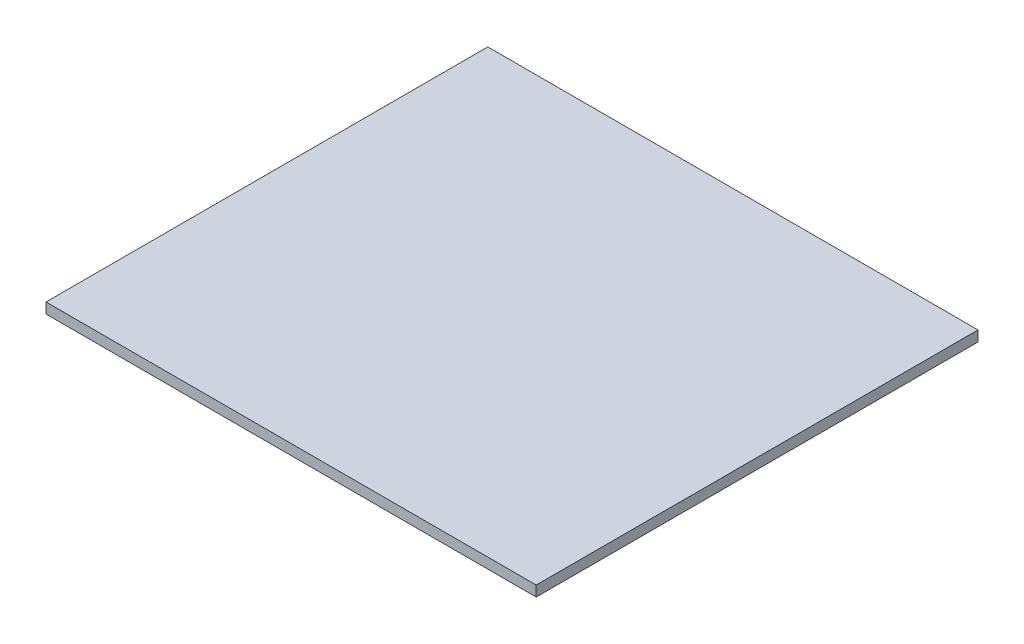
ISO-10303-21;
HEADER;
FILE_DESCRIPTION(('STEP AP214'),'2;1');
FILE_NAME('part.step','',(''),(''),'','','');
FILE_SCHEMA(('AUTOMOTIVE_DESIGN { 1 0 10303 214 1 1 1 1 }'));
ENDSEC;
DATA;
#1=APPLICATION_CONTEXT('core data for automotive mechanical design processes');
#2=APPLICATION_PROTOCOL_DEFINITION('international standard','automotive_design',2000,#1);
#3=PRODUCT_CONTEXT('',#1,'mechanical');
#4=PRODUCT('Part','Part','',(#3));
#5=PRODUCT_RELATED_PRODUCT_CATEGORY('part','',(#4));
#6=PRODUCT_DEFINITION_FORMATION('','',#4);
#7=PRODUCT_DEFINITION_CONTEXT('part definition',#1,'design');
#8=PRODUCT_DEFINITION('design','',#6,#7);
#9=PRODUCT_DEFINITION_SHAPE('','',#8);
#10=(LENGTH_UNIT() NAMED_UNIT(*) SI_UNIT(.MILLI.,.METRE.));
#11=(NAMED_UNIT(*) PLANE_ANGLE_UNIT() SI_UNIT($,.RADIAN.));
#12=(NAMED_UNIT(*) SI_UNIT($,.STERADIAN.) SOLID_ANGLE_UNIT());
#13=UNCERTAINTY_MEASURE_WITH_UNIT(LENGTH_MEASURE(1.E-05),#10,'distance_accuracy_value','');
#14=(GEOMETRIC_REPRESENTATION_CONTEXT(3) GLOBAL_UNCERTAINTY_ASSIGNED_CONTEXT((#13)) GLOBAL_UNIT_ASSIGNED_CONTEXT((#10,
#11,#12)) REPRESENTATION_CONTEXT('',''));
#15=CARTESIAN_POINT('',(0.,0.,0.));
#16=DIRECTION('',(0.,0.,1.));
#17=DIRECTION('',(1.,0.,0.));
#18=AXIS2_PLACEMENT_3D('',#15,#16,#17);
#19=CARTESIAN_POINT('',(41.,1.75,-36.95));
#20=DIRECTION('',(-1.,0.,0.));
#21=DIRECTION('',(0.,0.,1.));
#22=AXIS2_PLACEMENT_3D('',#19,#20,#21);
#23=PLANE('',#22);
#24=DIRECTION('',(0.,0.,-1.));
#25=VECTOR('',#24,1.);
#26=CARTESIAN_POINT('',(41.,0.,-36.95));
#27=LINE('',#26,#25);
#28=CARTESIAN_POINT('',(41.,0.,36.95));
#29=VERTEX_POINT('',#28);
#30=CARTESIAN_POINT('',(41.,0.,-36.95));
#31=VERTEX_POINT('',#30);
#32=EDGE_CURVE('E95',#29,#31,#27,.T.);
#33=ORIENTED_EDGE('',*,*,#32,.T.);
#34=DIRECTION('',(0.,-1.,0.));
#35=VECTOR('',#34,1.);
#36=CARTESIAN_POINT('',(41.,1.75,-36.95));
#37=LINE('',#36,#35);
#38=CARTESIAN_POINT('',(41.,1.75,-36.95));
#39=VERTEX_POINT('',#38);
#40=EDGE_CURVE('E11',#39,#31,#37,.T.);
#41=ORIENTED_EDGE('',*,*,#40,.F.);
#42=DIRECTION('',(0.,0.,-1.));
#43=VECTOR('',#42,1.);
#44=CARTESIAN_POINT('',(41.,1.75,-36.95));
#45=LINE('',#44,#43);
#46=CARTESIAN_POINT('',(41.,1.75,36.95));
#47=VERTEX_POINT('',#46);
#48=EDGE_CURVE('E83',#47,#39,#45,.T.);
#49=ORIENTED_EDGE('',*,*,#48,.F.);
#50=DIRECTION('',(0.,-1.,0.));
#51=VECTOR('',#50,1.);
#52=CARTESIAN_POINT('',(41.,1.75,36.95));
#53=LINE('',#52,#51);
#54=EDGE_CURVE('E91',#47,#29,#53,.T.);
#55=ORIENTED_EDGE('',*,*,#54,.T.);
#56=EDGE_LOOP('',(#33,#41,#49,#55));
#57=FACE_BOUND('',#56,.T.);
#58=ADVANCED_FACE('F32',(#57),#23,.F.);
#59=CARTESIAN_POINT('',(-41.,1.75,-36.95));
#60=DIRECTION('',(0.,0.,1.));
#61=DIRECTION('',(1.,0.,0.));
#62=AXIS2_PLACEMENT_3D('',#59,#60,#61);
#63=PLANE('',#62);
#64=DIRECTION('',(-1.,0.,0.));
#65=VECTOR('',#64,1.);
#66=CARTESIAN_POINT('',(-41.,0.,-36.95));
#67=LINE('',#66,#65);
#68=CARTESIAN_POINT('',(-41.,0.,-36.95));
#69=VERTEX_POINT('',#68);
#70=EDGE_CURVE('E87',#31,#69,#67,.T.);
#71=ORIENTED_EDGE('',*,*,#70,.T.);
#72=DIRECTION('',(0.,-1.,0.));
#73=VECTOR('',#72,1.);
#74=CARTESIAN_POINT('',(-41.,1.75,-36.95));
#75=LINE('',#74,#73);
#76=CARTESIAN_POINT('',(-41.,1.75,-36.95));
#77=VERTEX_POINT('',#76);
#78=EDGE_CURVE('E40',#77,#69,#75,.T.);
#79=ORIENTED_EDGE('',*,*,#78,.F.);
#80=DIRECTION('',(-1.,0.,0.));
#81=VECTOR('',#80,1.);
#82=CARTESIAN_POINT('',(-41.,1.75,-36.95));
#83=LINE('',#82,#81);
#84=EDGE_CURVE('E78',#39,#77,#83,.T.);
#85=ORIENTED_EDGE('',*,*,#84,.F.);
#86=ORIENTED_EDGE('',*,*,#40,.T.);
#87=EDGE_LOOP('',(#71,#79,#85,#86));
#88=FACE_BOUND('',#87,.T.);
#89=ADVANCED_FACE('F86',(#88),#63,.F.);
#90=CARTESIAN_POINT('',(-41.,1.75,-36.95));
#91=DIRECTION('',(1.,0.,0.));
#92=DIRECTION('',(0.,0.,-1.));
#93=AXIS2_PLACEMENT_3D('',#90,#91,#92);
#94=PLANE('',#93);
#95=DIRECTION('',(0.,0.,1.));
#96=VECTOR('',#95,1.);
#97=CARTESIAN_POINT('',(-41.,0.,-36.95));
#98=LINE('',#97,#96);
#99=CARTESIAN_POINT('',(-41.,0.,36.95));
#100=VERTEX_POINT('',#99);
#101=EDGE_CURVE('E65',#69,#100,#98,.T.);
#102=ORIENTED_EDGE('',*,*,#101,.T.);
#103=DIRECTION('',(0.,-1.,0.));
#104=VECTOR('',#103,1.);
#105=CARTESIAN_POINT('',(-41.,1.75,36.95));
#106=LINE('',#105,#104);
#107=CARTESIAN_POINT('',(-41.,1.75,36.95));
#108=VERTEX_POINT('',#107);
#109=EDGE_CURVE('E88',#108,#100,#106,.T.);
#110=ORIENTED_EDGE('',*,*,#109,.F.);
#111=DIRECTION('',(0.,0.,1.));
#112=VECTOR('',#111,1.);
#113=CARTESIAN_POINT('',(-41.,1.75,-36.95));
#114=LINE('',#113,#112);
#115=EDGE_CURVE('E81',#77,#108,#114,.T.);
#116=ORIENTED_EDGE('',*,*,#115,.F.);
#117=ORIENTED_EDGE('',*,*,#78,.T.);
#118=EDGE_LOOP('',(#102,#110,#116,#117));
#119=FACE_BOUND('',#118,.T.);
#120=ADVANCED_FACE('F89',(#119),#94,.F.);
#121=CARTESIAN_POINT('',(-41.,1.75,36.95));
#122=DIRECTION('',(0.,0.,-1.));
#123=DIRECTION('',(-1.,0.,0.));
#124=AXIS2_PLACEMENT_3D('',#121,#122,#123);
#125=PLANE('',#124);
#126=DIRECTION('',(1.,0.,0.));
#127=VECTOR('',#126,1.);
#128=CARTESIAN_POINT('',(-41.,0.,36.95));
#129=LINE('',#128,#127);
#130=EDGE_CURVE('E71',#100,#29,#129,.T.);
#131=ORIENTED_EDGE('',*,*,#130,.T.);
#132=ORIENTED_EDGE('',*,*,#54,.F.);
#133=DIRECTION('',(1.,0.,0.));
#134=VECTOR('',#133,1.);
#135=CARTESIAN_POINT('',(-41.,1.75,36.95));
#136=LINE('',#135,#134);
#137=EDGE_CURVE('E48',#108,#47,#136,.T.);
#138=ORIENTED_EDGE('',*,*,#137,.F.);
#139=ORIENTED_EDGE('',*,*,#109,.T.);
#140=EDGE_LOOP('',(#131,#132,#138,#139));
#141=FACE_BOUND('',#140,.T.);
#142=ADVANCED_FACE('F102',(#141),#125,.F.);
#143=CARTESIAN_POINT('',(0.,1.75,0.));
#144=DIRECTION('',(0.,1.,0.));
#145=DIRECTION('',(0.,0.,1.));
#146=AXIS2_PLACEMENT_3D('',#143,#144,#145);
#147=PLANE('',#146);
#148=ORIENTED_EDGE('',*,*,#48,.T.);
#149=ORIENTED_EDGE('',*,*,#84,.T.);
#150=ORIENTED_EDGE('',*,*,#115,.T.);
#151=ORIENTED_EDGE('',*,*,#137,.T.);
#152=EDGE_LOOP('',(#148,#149,#150,#151));
#153=FACE_BOUND('',#152,.T.);
#154=ADVANCED_FACE('F79',(#153),#147,.T.);
#155=CARTESIAN_POINT('',(0.,0.,0.));
#156=DIRECTION('',(0.,1.,0.));
#157=DIRECTION('',(0.,0.,1.));
#158=AXIS2_PLACEMENT_3D('',#155,#156,#157);
#159=PLANE('',#158);
#160=ORIENTED_EDGE('',*,*,#32,.F.);
#161=ORIENTED_EDGE('',*,*,#130,.F.);
#162=ORIENTED_EDGE('',*,*,#101,.F.);
#163=ORIENTED_EDGE('',*,*,#70,.F.);
#164=EDGE_LOOP('',(#160,#161,#162,#163));
#165=FACE_BOUND('',#164,.T.);
#166=ADVANCED_FACE('F105',(#165),#159,.F.);
#167=CLOSED_SHELL('',(#58,#89,#120,#142,#154,#166));
#168=MANIFOLD_SOLID_BREP('B2',#167);
#169=ADVANCED_BREP_SHAPE_REPRESENTATION('',(#18,#168),#14);
#170=SHAPE_DEFINITION_REPRESENTATION(#9,#169);
ENDSEC;
END-ISO-10303-21;
